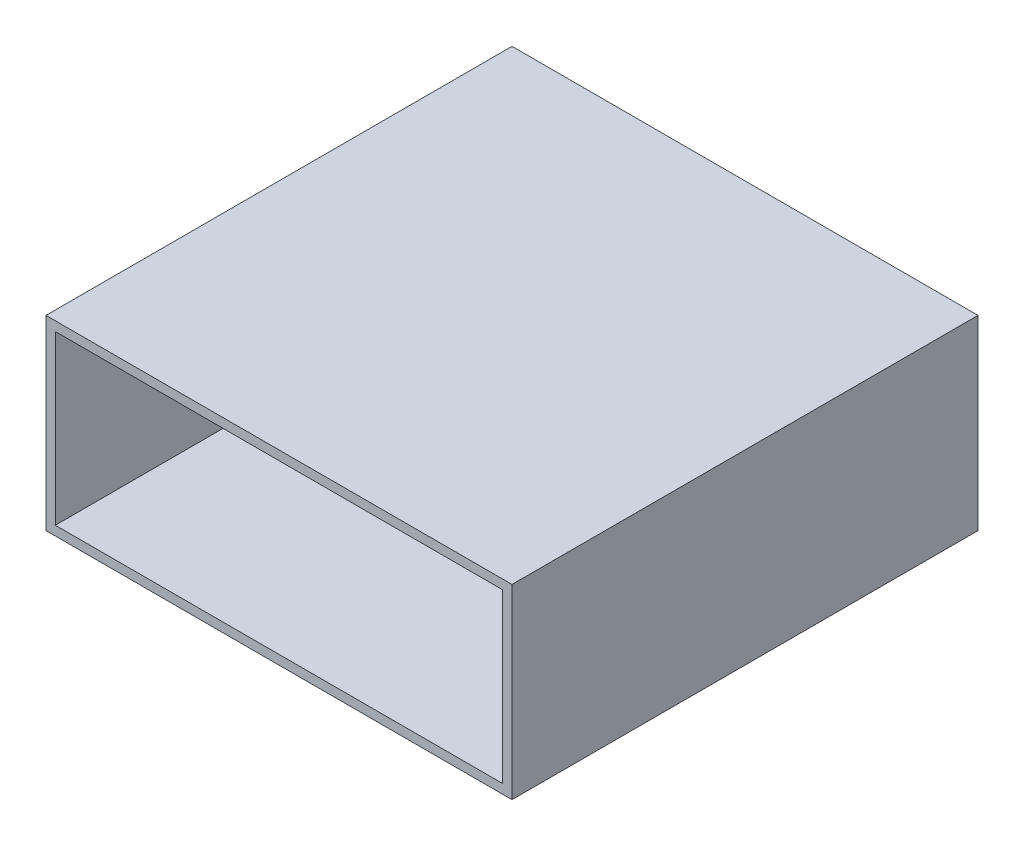
ISO-10303-21;
HEADER;
FILE_DESCRIPTION(('STEP AP214'),'2;1');
FILE_NAME('part.step','',(''),(''),'','','');
FILE_SCHEMA(('AUTOMOTIVE_DESIGN { 1 0 10303 214 1 1 1 1 }'));
ENDSEC;
DATA;
#1=APPLICATION_CONTEXT('core data for automotive mechanical design processes');
#2=APPLICATION_PROTOCOL_DEFINITION('international standard','automotive_design',2000,#1);
#3=PRODUCT_CONTEXT('',#1,'mechanical');
#4=PRODUCT('Part','Part','',(#3));
#5=PRODUCT_RELATED_PRODUCT_CATEGORY('part','',(#4));
#6=PRODUCT_DEFINITION_FORMATION('','',#4);
#7=PRODUCT_DEFINITION_CONTEXT('part definition',#1,'design');
#8=PRODUCT_DEFINITION('design','',#6,#7);
#9=PRODUCT_DEFINITION_SHAPE('','',#8);
#10=(LENGTH_UNIT() NAMED_UNIT(*) SI_UNIT(.MILLI.,.METRE.));
#11=(NAMED_UNIT(*) PLANE_ANGLE_UNIT() SI_UNIT($,.RADIAN.));
#12=(NAMED_UNIT(*) SI_UNIT($,.STERADIAN.) SOLID_ANGLE_UNIT());
#13=UNCERTAINTY_MEASURE_WITH_UNIT(LENGTH_MEASURE(1.E-05),#10,'distance_accuracy_value','');
#14=(GEOMETRIC_REPRESENTATION_CONTEXT(3) GLOBAL_UNCERTAINTY_ASSIGNED_CONTEXT((#13)) GLOBAL_UNIT_ASSIGNED_CONTEXT((#10,
#11,#12)) REPRESENTATION_CONTEXT('',''));
#15=CARTESIAN_POINT('',(0.,0.,0.));
#16=DIRECTION('',(0.,0.,1.));
#17=DIRECTION('',(1.,0.,0.));
#18=AXIS2_PLACEMENT_3D('',#15,#16,#17);
#19=CARTESIAN_POINT('',(0.,0.,50.));
#20=DIRECTION('',(0.,0.,-1.));
#21=DIRECTION('',(-1.,0.,0.));
#22=AXIS2_PLACEMENT_3D('',#19,#20,#21);
#23=PLANE('',#22);
#24=DIRECTION('',(0.,-1.,0.));
#25=VECTOR('',#24,1.);
#26=CARTESIAN_POINT('',(0.,0.,50.));
#27=LINE('',#26,#25);
#28=CARTESIAN_POINT('',(0.,20.,50.));
#29=VERTEX_POINT('',#28);
#30=CARTESIAN_POINT('',(0.,0.,50.));
#31=VERTEX_POINT('',#30);
#32=EDGE_CURVE('E136',#29,#31,#27,.T.);
#33=ORIENTED_EDGE('',*,*,#32,.T.);
#34=DIRECTION('',(1.,0.,0.));
#35=VECTOR('',#34,1.);
#36=CARTESIAN_POINT('',(0.,0.,50.));
#37=LINE('',#36,#35);
#38=CARTESIAN_POINT('',(50.,0.,50.));
#39=VERTEX_POINT('',#38);
#40=EDGE_CURVE('E139',#31,#39,#37,.T.);
#41=ORIENTED_EDGE('',*,*,#40,.T.);
#42=DIRECTION('',(0.,1.,0.));
#43=VECTOR('',#42,1.);
#44=CARTESIAN_POINT('',(50.,0.,50.));
#45=LINE('',#44,#43);
#46=CARTESIAN_POINT('',(50.,20.,50.));
#47=VERTEX_POINT('',#46);
#48=EDGE_CURVE('E142',#39,#47,#45,.T.);
#49=ORIENTED_EDGE('',*,*,#48,.T.);
#50=DIRECTION('',(-1.,0.,0.));
#51=VECTOR('',#50,1.);
#52=CARTESIAN_POINT('',(0.,20.,50.));
#53=LINE('',#52,#51);
#54=EDGE_CURVE('E144',#47,#29,#53,.T.);
#55=ORIENTED_EDGE('',*,*,#54,.T.);
#56=EDGE_LOOP('',(#33,#41,#49,#55));
#57=FACE_BOUND('',#56,.T.);
#58=DIRECTION('',(0.,-1.,0.));
#59=VECTOR('',#58,1.);
#60=CARTESIAN_POINT('',(1.,1.,50.));
#61=LINE('',#60,#59);
#62=CARTESIAN_POINT('',(1.,19.,50.));
#63=VERTEX_POINT('',#62);
#64=CARTESIAN_POINT('',(1.,1.,50.));
#65=VERTEX_POINT('',#64);
#66=EDGE_CURVE('E100',#63,#65,#61,.T.);
#67=ORIENTED_EDGE('',*,*,#66,.F.);
#68=DIRECTION('',(-1.,0.,0.));
#69=VECTOR('',#68,1.);
#70=CARTESIAN_POINT('',(1.,19.,50.));
#71=LINE('',#70,#69);
#72=CARTESIAN_POINT('',(49.,19.,50.));
#73=VERTEX_POINT('',#72);
#74=EDGE_CURVE('E122',#73,#63,#71,.T.);
#75=ORIENTED_EDGE('',*,*,#74,.F.);
#76=DIRECTION('',(0.,1.,0.));
#77=VECTOR('',#76,1.);
#78=CARTESIAN_POINT('',(49.,1.,50.));
#79=LINE('',#78,#77);
#80=CARTESIAN_POINT('',(49.,1.,50.));
#81=VERTEX_POINT('',#80);
#82=EDGE_CURVE('E120',#81,#73,#79,.T.);
#83=ORIENTED_EDGE('',*,*,#82,.F.);
#84=DIRECTION('',(1.,0.,0.));
#85=VECTOR('',#84,1.);
#86=CARTESIAN_POINT('',(1.,1.,50.));
#87=LINE('',#86,#85);
#88=EDGE_CURVE('E108',#65,#81,#87,.T.);
#89=ORIENTED_EDGE('',*,*,#88,.F.);
#90=EDGE_LOOP('',(#67,#75,#83,#89));
#91=FACE_BOUND('',#90,.T.);
#92=ADVANCED_FACE('F35',(#57,#91),#23,.F.);
#93=CARTESIAN_POINT('',(0.,0.,0.));
#94=DIRECTION('',(0.,0.,-1.));
#95=DIRECTION('',(-1.,0.,0.));
#96=AXIS2_PLACEMENT_3D('',#93,#94,#95);
#97=PLANE('',#96);
#98=DIRECTION('',(0.,-1.,0.));
#99=VECTOR('',#98,1.);
#100=CARTESIAN_POINT('',(0.,0.,0.));
#101=LINE('',#100,#99);
#102=CARTESIAN_POINT('',(0.,20.,0.));
#103=VERTEX_POINT('',#102);
#104=CARTESIAN_POINT('',(0.,0.,0.));
#105=VERTEX_POINT('',#104);
#106=EDGE_CURVE('E116',#103,#105,#101,.T.);
#107=ORIENTED_EDGE('',*,*,#106,.F.);
#108=DIRECTION('',(-1.,0.,0.));
#109=VECTOR('',#108,1.);
#110=CARTESIAN_POINT('',(0.,20.,0.));
#111=LINE('',#110,#109);
#112=CARTESIAN_POINT('',(50.,20.,0.));
#113=VERTEX_POINT('',#112);
#114=EDGE_CURVE('E140',#113,#103,#111,.T.);
#115=ORIENTED_EDGE('',*,*,#114,.F.);
#116=DIRECTION('',(0.,1.,0.));
#117=VECTOR('',#116,1.);
#118=CARTESIAN_POINT('',(50.,0.,0.));
#119=LINE('',#118,#117);
#120=CARTESIAN_POINT('',(50.,0.,0.));
#121=VERTEX_POINT('',#120);
#122=EDGE_CURVE('E151',#121,#113,#119,.T.);
#123=ORIENTED_EDGE('',*,*,#122,.F.);
#124=DIRECTION('',(1.,0.,0.));
#125=VECTOR('',#124,1.);
#126=CARTESIAN_POINT('',(0.,0.,0.));
#127=LINE('',#126,#125);
#128=EDGE_CURVE('E149',#105,#121,#127,.T.);
#129=ORIENTED_EDGE('',*,*,#128,.F.);
#130=EDGE_LOOP('',(#107,#115,#123,#129));
#131=FACE_BOUND('',#130,.T.);
#132=DIRECTION('',(-1.,0.,0.));
#133=VECTOR('',#132,1.);
#134=CARTESIAN_POINT('',(1.,19.,0.));
#135=LINE('',#134,#133);
#136=CARTESIAN_POINT('',(49.,19.,0.));
#137=VERTEX_POINT('',#136);
#138=CARTESIAN_POINT('',(1.,19.,0.));
#139=VERTEX_POINT('',#138);
#140=EDGE_CURVE('E109',#137,#139,#135,.T.);
#141=ORIENTED_EDGE('',*,*,#140,.T.);
#142=DIRECTION('',(0.,-1.,0.));
#143=VECTOR('',#142,1.);
#144=CARTESIAN_POINT('',(1.,1.,0.));
#145=LINE('',#144,#143);
#146=CARTESIAN_POINT('',(1.,1.,0.));
#147=VERTEX_POINT('',#146);
#148=EDGE_CURVE('E58',#139,#147,#145,.T.);
#149=ORIENTED_EDGE('',*,*,#148,.T.);
#150=DIRECTION('',(1.,0.,0.));
#151=VECTOR('',#150,1.);
#152=CARTESIAN_POINT('',(1.,1.,0.));
#153=LINE('',#152,#151);
#154=CARTESIAN_POINT('',(49.,1.,0.));
#155=VERTEX_POINT('',#154);
#156=EDGE_CURVE('E115',#147,#155,#153,.T.);
#157=ORIENTED_EDGE('',*,*,#156,.T.);
#158=DIRECTION('',(0.,1.,0.));
#159=VECTOR('',#158,1.);
#160=CARTESIAN_POINT('',(49.,1.,0.));
#161=LINE('',#160,#159);
#162=EDGE_CURVE('E128',#155,#137,#161,.T.);
#163=ORIENTED_EDGE('',*,*,#162,.T.);
#164=EDGE_LOOP('',(#141,#149,#157,#163));
#165=FACE_BOUND('',#164,.T.);
#166=ADVANCED_FACE('F169',(#131,#165),#97,.T.);
#167=CARTESIAN_POINT('',(0.,0.,50.));
#168=DIRECTION('',(1.,0.,0.));
#169=DIRECTION('',(0.,0.,-1.));
#170=AXIS2_PLACEMENT_3D('',#167,#168,#169);
#171=PLANE('',#170);
#172=ORIENTED_EDGE('',*,*,#106,.T.);
#173=DIRECTION('',(0.,0.,-1.));
#174=VECTOR('',#173,1.);
#175=CARTESIAN_POINT('',(0.,0.,50.));
#176=LINE('',#175,#174);
#177=EDGE_CURVE('E11',#31,#105,#176,.T.);
#178=ORIENTED_EDGE('',*,*,#177,.F.);
#179=ORIENTED_EDGE('',*,*,#32,.F.);
#180=DIRECTION('',(0.,0.,-1.));
#181=VECTOR('',#180,1.);
#182=CARTESIAN_POINT('',(0.,20.,50.));
#183=LINE('',#182,#181);
#184=EDGE_CURVE('E146',#29,#103,#183,.T.);
#185=ORIENTED_EDGE('',*,*,#184,.T.);
#186=EDGE_LOOP('',(#172,#178,#179,#185));
#187=FACE_BOUND('',#186,.T.);
#188=ADVANCED_FACE('F37',(#187),#171,.F.);
#189=CARTESIAN_POINT('',(0.,0.,50.));
#190=DIRECTION('',(0.,1.,0.));
#191=DIRECTION('',(0.,0.,1.));
#192=AXIS2_PLACEMENT_3D('',#189,#190,#191);
#193=PLANE('',#192);
#194=ORIENTED_EDGE('',*,*,#128,.T.);
#195=DIRECTION('',(0.,0.,-1.));
#196=VECTOR('',#195,1.);
#197=CARTESIAN_POINT('',(50.,0.,50.));
#198=LINE('',#197,#196);
#199=EDGE_CURVE('E43',#39,#121,#198,.T.);
#200=ORIENTED_EDGE('',*,*,#199,.F.);
#201=ORIENTED_EDGE('',*,*,#40,.F.);
#202=ORIENTED_EDGE('',*,*,#177,.T.);
#203=EDGE_LOOP('',(#194,#200,#201,#202));
#204=FACE_BOUND('',#203,.T.);
#205=ADVANCED_FACE('F179',(#204),#193,.F.);
#206=CARTESIAN_POINT('',(50.,0.,50.));
#207=DIRECTION('',(-1.,0.,0.));
#208=DIRECTION('',(0.,0.,1.));
#209=AXIS2_PLACEMENT_3D('',#206,#207,#208);
#210=PLANE('',#209);
#211=ORIENTED_EDGE('',*,*,#122,.T.);
#212=DIRECTION('',(0.,0.,-1.));
#213=VECTOR('',#212,1.);
#214=CARTESIAN_POINT('',(50.,20.,50.));
#215=LINE('',#214,#213);
#216=EDGE_CURVE('E156',#47,#113,#215,.T.);
#217=ORIENTED_EDGE('',*,*,#216,.F.);
#218=ORIENTED_EDGE('',*,*,#48,.F.);
#219=ORIENTED_EDGE('',*,*,#199,.T.);
#220=EDGE_LOOP('',(#211,#217,#218,#219));
#221=FACE_BOUND('',#220,.T.);
#222=ADVANCED_FACE('F163',(#221),#210,.F.);
#223=CARTESIAN_POINT('',(0.,20.,50.));
#224=DIRECTION('',(0.,-1.,0.));
#225=DIRECTION('',(0.,0.,-1.));
#226=AXIS2_PLACEMENT_3D('',#223,#224,#225);
#227=PLANE('',#226);
#228=ORIENTED_EDGE('',*,*,#114,.T.);
#229=ORIENTED_EDGE('',*,*,#184,.F.);
#230=ORIENTED_EDGE('',*,*,#54,.F.);
#231=ORIENTED_EDGE('',*,*,#216,.T.);
#232=EDGE_LOOP('',(#228,#229,#230,#231));
#233=FACE_BOUND('',#232,.T.);
#234=ADVANCED_FACE('F173',(#233),#227,.F.);
#235=CARTESIAN_POINT('',(1.,1.,50.));
#236=DIRECTION('',(1.,0.,0.));
#237=DIRECTION('',(0.,0.,-1.));
#238=AXIS2_PLACEMENT_3D('',#235,#236,#237);
#239=PLANE('',#238);
#240=ORIENTED_EDGE('',*,*,#148,.F.);
#241=DIRECTION('',(0.,0.,-1.));
#242=VECTOR('',#241,1.);
#243=CARTESIAN_POINT('',(1.,19.,50.));
#244=LINE('',#243,#242);
#245=EDGE_CURVE('E104',#63,#139,#244,.T.);
#246=ORIENTED_EDGE('',*,*,#245,.F.);
#247=ORIENTED_EDGE('',*,*,#66,.T.);
#248=DIRECTION('',(0.,0.,-1.));
#249=VECTOR('',#248,1.);
#250=CARTESIAN_POINT('',(1.,1.,50.));
#251=LINE('',#250,#249);
#252=EDGE_CURVE('E103',#65,#147,#251,.T.);
#253=ORIENTED_EDGE('',*,*,#252,.T.);
#254=EDGE_LOOP('',(#240,#246,#247,#253));
#255=FACE_BOUND('',#254,.T.);
#256=ADVANCED_FACE('F102',(#255),#239,.T.);
#257=CARTESIAN_POINT('',(1.,1.,50.));
#258=DIRECTION('',(0.,1.,0.));
#259=DIRECTION('',(0.,0.,1.));
#260=AXIS2_PLACEMENT_3D('',#257,#258,#259);
#261=PLANE('',#260);
#262=ORIENTED_EDGE('',*,*,#156,.F.);
#263=ORIENTED_EDGE('',*,*,#252,.F.);
#264=ORIENTED_EDGE('',*,*,#88,.T.);
#265=DIRECTION('',(0.,0.,-1.));
#266=VECTOR('',#265,1.);
#267=CARTESIAN_POINT('',(49.,1.,50.));
#268=LINE('',#267,#266);
#269=EDGE_CURVE('E117',#81,#155,#268,.T.);
#270=ORIENTED_EDGE('',*,*,#269,.T.);
#271=EDGE_LOOP('',(#262,#263,#264,#270));
#272=FACE_BOUND('',#271,.T.);
#273=ADVANCED_FACE('F112',(#272),#261,.T.);
#274=CARTESIAN_POINT('',(49.,1.,50.));
#275=DIRECTION('',(-1.,0.,0.));
#276=DIRECTION('',(0.,0.,1.));
#277=AXIS2_PLACEMENT_3D('',#274,#275,#276);
#278=PLANE('',#277);
#279=ORIENTED_EDGE('',*,*,#162,.F.);
#280=ORIENTED_EDGE('',*,*,#269,.F.);
#281=ORIENTED_EDGE('',*,*,#82,.T.);
#282=DIRECTION('',(0.,0.,-1.));
#283=VECTOR('',#282,1.);
#284=CARTESIAN_POINT('',(49.,19.,50.));
#285=LINE('',#284,#283);
#286=EDGE_CURVE('E50',#73,#137,#285,.T.);
#287=ORIENTED_EDGE('',*,*,#286,.T.);
#288=EDGE_LOOP('',(#279,#280,#281,#287));
#289=FACE_BOUND('',#288,.T.);
#290=ADVANCED_FACE('F202',(#289),#278,.T.);
#291=CARTESIAN_POINT('',(1.,19.,50.));
#292=DIRECTION('',(0.,-1.,0.));
#293=DIRECTION('',(0.,0.,-1.));
#294=AXIS2_PLACEMENT_3D('',#291,#292,#293);
#295=PLANE('',#294);
#296=ORIENTED_EDGE('',*,*,#140,.F.);
#297=ORIENTED_EDGE('',*,*,#286,.F.);
#298=ORIENTED_EDGE('',*,*,#74,.T.);
#299=ORIENTED_EDGE('',*,*,#245,.T.);
#300=EDGE_LOOP('',(#296,#297,#298,#299));
#301=FACE_BOUND('',#300,.T.);
#302=ADVANCED_FACE('F206',(#301),#295,.T.);
#303=CLOSED_SHELL('',(#92,#166,#188,#205,#222,#234,#256,#273,#290,#302));
#304=MANIFOLD_SOLID_BREP('B2',#303);
#305=ADVANCED_BREP_SHAPE_REPRESENTATION('',(#18,#304),#14);
#306=SHAPE_DEFINITION_REPRESENTATION(#9,#305);
ENDSEC;
END-ISO-10303-21;
